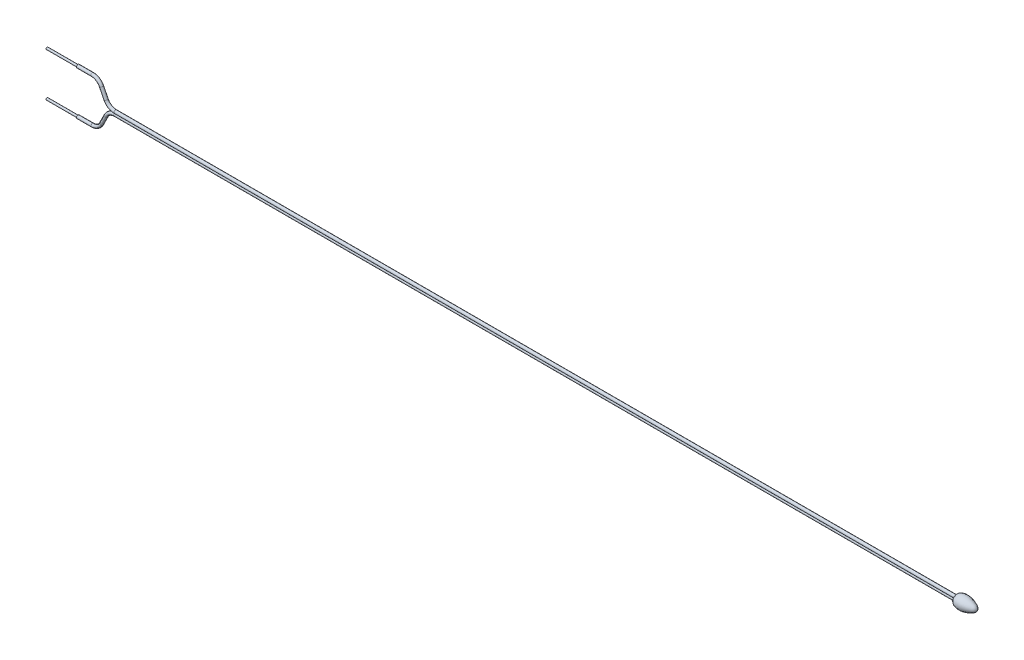
ISO-10303-21;
HEADER;
FILE_DESCRIPTION(('STEP AP214'),'2;1');
FILE_NAME('part.step','',(''),(''),'','','');
FILE_SCHEMA(('AUTOMOTIVE_DESIGN { 1 0 10303 214 1 1 1 1 }'));
ENDSEC;
DATA;
#1=APPLICATION_CONTEXT('core data for automotive mechanical design processes');
#2=APPLICATION_PROTOCOL_DEFINITION('international standard','automotive_design',2000,#1);
#3=PRODUCT_CONTEXT('',#1,'mechanical');
#4=PRODUCT('Part','Part','',(#3));
#5=PRODUCT_RELATED_PRODUCT_CATEGORY('part','',(#4));
#6=PRODUCT_DEFINITION_FORMATION('','',#4);
#7=PRODUCT_DEFINITION_CONTEXT('part definition',#1,'design');
#8=PRODUCT_DEFINITION('design','',#6,#7);
#9=PRODUCT_DEFINITION_SHAPE('','',#8);
#10=(LENGTH_UNIT() NAMED_UNIT(*) SI_UNIT(.MILLI.,.METRE.));
#11=(NAMED_UNIT(*) PLANE_ANGLE_UNIT() SI_UNIT($,.RADIAN.));
#12=(NAMED_UNIT(*) SI_UNIT($,.STERADIAN.) SOLID_ANGLE_UNIT());
#13=UNCERTAINTY_MEASURE_WITH_UNIT(LENGTH_MEASURE(1.E-05),#10,'distance_accuracy_value','');
#14=(GEOMETRIC_REPRESENTATION_CONTEXT(3) GLOBAL_UNCERTAINTY_ASSIGNED_CONTEXT((#13)) GLOBAL_UNIT_ASSIGNED_CONTEXT((#10,
#11,#12)) REPRESENTATION_CONTEXT('',''));
#15=CARTESIAN_POINT('',(0.,0.,0.));
#16=DIRECTION('',(0.,0.,1.));
#17=DIRECTION('',(1.,0.,0.));
#18=AXIS2_PLACEMENT_3D('',#15,#16,#17);
#19=CARTESIAN_POINT('',(-83.6180339887499,-2.11999999999998,0.));
#20=DIRECTION('',(-1.,0.,0.));
#21=DIRECTION('',(0.,-1.,0.));
#22=AXIS2_PLACEMENT_3D('',#19,#20,#21);
#23=CYLINDRICAL_SURFACE('',#22,0.15);
#24=CARTESIAN_POINT('',(-83.6180339887499,-2.11999999999998,0.));
#25=DIRECTION('',(1.,0.,0.));
#26=DIRECTION('',(0.,0.,1.));
#27=AXIS2_PLACEMENT_3D('',#24,#25,#26);
#28=CIRCLE('',#27,0.15);
#29=CARTESIAN_POINT('',(-83.6180339887499,-2.26999999999997,0.));
#30=VERTEX_POINT('',#29);
#31=EDGE_CURVE('E97',#30,#30,#28,.F.);
#32=ORIENTED_EDGE('',*,*,#31,.T.);
#33=EDGE_LOOP('',(#32));
#34=FACE_BOUND('',#33,.T.);
#35=CARTESIAN_POINT('',(-85.,-2.11999999999998,0.));
#36=DIRECTION('',(-1.,0.,0.));
#37=DIRECTION('',(0.,0.,1.));
#38=AXIS2_PLACEMENT_3D('',#35,#36,#37);
#39=CIRCLE('',#38,0.15);
#40=CARTESIAN_POINT('',(-85.,-2.11999999999998,0.15));
#41=VERTEX_POINT('',#40);
#42=EDGE_CURVE('E54',#41,#41,#39,.F.);
#43=ORIENTED_EDGE('',*,*,#42,.T.);
#44=EDGE_LOOP('',(#43));
#45=FACE_BOUND('',#44,.T.);
#46=ADVANCED_FACE('F49',(#34,#45),#23,.T.);
#47=CARTESIAN_POINT('',(-83.6180339887499,2.11999999999998,0.));
#48=DIRECTION('',(-1.,0.,0.));
#49=DIRECTION('',(0.,-1.,0.));
#50=AXIS2_PLACEMENT_3D('',#47,#48,#49);
#51=CYLINDRICAL_SURFACE('',#50,0.15);
#52=CARTESIAN_POINT('',(-83.6180339887499,2.11999999999998,0.));
#53=DIRECTION('',(-1.,0.,0.));
#54=DIRECTION('',(0.,0.,1.));
#55=AXIS2_PLACEMENT_3D('',#52,#53,#54);
#56=CIRCLE('',#55,0.15);
#57=CARTESIAN_POINT('',(-83.6180339887499,2.26999999999997,0.));
#58=VERTEX_POINT('',#57);
#59=EDGE_CURVE('E141',#58,#58,#56,.T.);
#60=ORIENTED_EDGE('',*,*,#59,.T.);
#61=EDGE_LOOP('',(#60));
#62=FACE_BOUND('',#61,.T.);
#63=CARTESIAN_POINT('',(-85.,2.11999999999998,0.));
#64=DIRECTION('',(-1.,0.,0.));
#65=DIRECTION('',(0.,0.,1.));
#66=AXIS2_PLACEMENT_3D('',#63,#64,#65);
#67=CIRCLE('',#66,0.15);
#68=CARTESIAN_POINT('',(-85.,2.11999999999998,0.15));
#69=VERTEX_POINT('',#68);
#70=EDGE_CURVE('E89',#69,#69,#67,.F.);
#71=ORIENTED_EDGE('',*,*,#70,.T.);
#72=EDGE_LOOP('',(#71));
#73=FACE_BOUND('',#72,.T.);
#74=ADVANCED_FACE('F183',(#62,#73),#51,.T.);
#75=CARTESIAN_POINT('',(2.,0.,0.));
#76=CARTESIAN_POINT('',(1.98555284849733,0.226242678434408,0.));
#77=CARTESIAN_POINT('',(1.44706791542776,0.470950786975522,0.));
#78=CARTESIAN_POINT('',(0.767947767259633,0.661200883018577,0.));
#79=CARTESIAN_POINT('',(0.11509678999317,0.55180024629002,0.));
#80=CARTESIAN_POINT('',(0.,0.3,0.));
#81=B_SPLINE_CURVE_WITH_KNOTS('',3,(#75,#76,#77,#78,#79,#80),.UNSPECIFIED.,.F.,.F.,(4,1,1,4),
(0.,0.27710911797728,0.65585589104176,1.),.UNSPECIFIED.);
#82=CARTESIAN_POINT('',(0.,0.,0.));
#83=DIRECTION('',(-1.,0.,0.));
#84=AXIS1_PLACEMENT('',#82,#83);
#85=SURFACE_OF_REVOLUTION('',#81,#84);
#86=CARTESIAN_POINT('',(0.,0.,0.));
#87=DIRECTION('',(-1.,0.,0.));
#88=DIRECTION('',(0.,0.,1.));
#89=AXIS2_PLACEMENT_3D('',#86,#87,#88);
#90=CIRCLE('',#89,0.3);
#91=CARTESIAN_POINT('',(0.,0.,0.3));
#92=VERTEX_POINT('',#91);
#93=EDGE_CURVE('E132',#92,#92,#90,.T.);
#94=ORIENTED_EDGE('',*,*,#93,.F.);
#95=EDGE_LOOP('',(#94));
#96=FACE_BOUND('',#95,.T.);
#97=CARTESIAN_POINT('',(2.,0.,0.));
#98=VERTEX_POINT('',#97);
#99=VERTEX_LOOP('',#98);
#100=FACE_BOUND('',#99,.T.);
#101=ADVANCED_FACE('F51',(#96,#100),#85,.T.);
#102=CARTESIAN_POINT('',(0.,0.,0.));
#103=DIRECTION('',(1.,0.,0.));
#104=DIRECTION('',(0.,0.,-1.));
#105=AXIS2_PLACEMENT_3D('',#102,#103,#104);
#106=PLANE('',#105);
#107=CARTESIAN_POINT('',(0.,0.11999999999999,0.));
#108=DIRECTION('',(-1.,0.,0.));
#109=DIRECTION('',(0.,0.,1.));
#110=AXIS2_PLACEMENT_3D('',#107,#108,#109);
#111=CIRCLE('',#110,0.15);
#112=CARTESIAN_POINT('',(0.,0.,0.0900000000000177));
#113=VERTEX_POINT('',#112);
#114=CARTESIAN_POINT('',(0.,0.,-0.0900000000000177));
#115=VERTEX_POINT('',#114);
#116=EDGE_CURVE('E60',#113,#115,#111,.T.);
#117=ORIENTED_EDGE('',*,*,#116,.F.);
#118=CARTESIAN_POINT('',(0.,-0.11999999999999,0.));
#119=DIRECTION('',(1.,0.,0.));
#120=DIRECTION('',(0.,0.,1.));
#121=AXIS2_PLACEMENT_3D('',#118,#119,#120);
#122=CIRCLE('',#121,0.15);
#123=EDGE_CURVE('E73',#115,#113,#122,.F.);
#124=ORIENTED_EDGE('',*,*,#123,.F.);
#125=EDGE_LOOP('',(#117,#124));
#126=FACE_BOUND('',#125,.T.);
#127=ORIENTED_EDGE('',*,*,#93,.T.);
#128=EDGE_LOOP('',(#127));
#129=FACE_BOUND('',#128,.T.);
#130=ADVANCED_FACE('F199',(#126,#129),#106,.F.);
#131=CARTESIAN_POINT('',(0.,0.11999999999999,0.));
#132=DIRECTION('',(-1.,0.,0.));
#133=DIRECTION('',(0.,-1.,0.));
#134=AXIS2_PLACEMENT_3D('',#131,#132,#133);
#135=CYLINDRICAL_SURFACE('',#134,0.15);
#136=DIRECTION('',(-1.,0.,0.));
#137=VECTOR('',#136,1.);
#138=CARTESIAN_POINT('',(-40.690983005625,0.,0.0900000000000201));
#139=LINE('',#138,#137);
#140=CARTESIAN_POINT('',(-81.3819660112501,0.,0.0900000000000256));
#141=VERTEX_POINT('',#140);
#142=EDGE_CURVE('E67',#113,#141,#139,.T.);
#143=ORIENTED_EDGE('',*,*,#142,.F.);
#144=ORIENTED_EDGE('',*,*,#116,.T.);
#145=DIRECTION('',(-1.,0.,0.));
#146=VECTOR('',#145,1.);
#147=CARTESIAN_POINT('',(-40.690983005625,0.,-0.0900000000000201));
#148=LINE('',#147,#146);
#149=CARTESIAN_POINT('',(-81.3819660112501,0.,-0.0900000000000258));
#150=VERTEX_POINT('',#149);
#151=EDGE_CURVE('E92',#150,#115,#148,.F.);
#152=ORIENTED_EDGE('',*,*,#151,.F.);
#153=CARTESIAN_POINT('',(-81.3819660112501,0.11999999999998,0.));
#154=DIRECTION('',(-1.,0.,0.));
#155=DIRECTION('',(0.,0.,1.));
#156=AXIS2_PLACEMENT_3D('',#153,#154,#155);
#157=CIRCLE('',#156,0.15);
#158=EDGE_CURVE('E83',#141,#150,#157,.T.);
#159=ORIENTED_EDGE('',*,*,#158,.F.);
#160=EDGE_LOOP('',(#143,#144,#152,#159));
#161=FACE_BOUND('',#160,.T.);
#162=ADVANCED_FACE('F93',(#161),#135,.T.);
#163=CARTESIAN_POINT('',(-81.3819660112501,1.11999999999999,0.));
#164=DIRECTION('',(0.,0.,-1.));
#165=DIRECTION('',(-1.,0.,0.));
#166=AXIS2_PLACEMENT_3D('',#163,#164,#165);
#167=TOROIDAL_SURFACE('',#166,1.00000000000001,0.15);
#168=CARTESIAN_POINT('',(-81.3817660112501,0.,0.0899999761904966));
#169=CARTESIAN_POINT('',(-81.3941999511317,0.,0.0899946856643932));
#170=CARTESIAN_POINT('',(-81.4066367126895,0.,0.0897292557588365));
#171=CARTESIAN_POINT('',(-81.4315179020639,0.,0.0886198504912969));
#172=CARTESIAN_POINT('',(-81.4439622584967,0.,0.0877743012960616));
#173=CARTESIAN_POINT('',(-81.4692420517624,0.,0.0854036456330393));
#174=CARTESIAN_POINT('',(-81.4820753363417,0.,0.0838550450728482));
#175=CARTESIAN_POINT('',(-81.507604881026,0.,0.0799277513643478));
#176=CARTESIAN_POINT('',(-81.5203012950561,0.,0.0775501197486745));
#177=CARTESIAN_POINT('',(-81.5452942327621,0.,0.0717308778791677));
#178=CARTESIAN_POINT('',(-81.5575936749774,0.,0.0683018064394664));
#179=CARTESIAN_POINT('',(-81.5816386670103,0.,0.0599109010634009));
#180=CARTESIAN_POINT('',(-81.5933874154472,0.,0.054959652055676));
#181=CARTESIAN_POINT('',(-81.6089976089805,0.,0.0460866496410345));
#182=CARTESIAN_POINT('',(-81.6134635900783,0.,0.0432479765029173));
#183=CARTESIAN_POINT('',(-81.6219376673659,0.,0.0369596194342492));
#184=CARTESIAN_POINT('',(-81.6259479391753,0.,0.033513058189557));
#185=CARTESIAN_POINT('',(-81.6312473522799,0.,0.0278418485689292));
#186=CARTESIAN_POINT('',(-81.6328613528702,0.,0.0259230812939052));
#187=CARTESIAN_POINT('',(-81.6358262335061,0.,0.0218860812592556));
#188=CARTESIAN_POINT('',(-81.6371769582982,0.,0.0197677318918337));
#189=CARTESIAN_POINT('',(-81.6395336118726,0.,0.0153035426964348));
#190=CARTESIAN_POINT('',(-81.6405343922266,0.,0.0129549084049622));
#191=CARTESIAN_POINT('',(-81.6420455870909,0.,0.00810601906349956));
#192=CARTESIAN_POINT('',(-81.6425573775655,0.,0.00560621063253131));
#193=CARTESIAN_POINT('',(-81.6429831732717,0.,0.000909082897122896));
#194=CARTESIAN_POINT('',(-81.6429708335507,0.,-0.00128159195684645));
#195=CARTESIAN_POINT('',(-81.6425305976109,0.,-0.00562124633058561));
#196=CARTESIAN_POINT('',(-81.6421023906153,0.,-0.00777019344224564));
#197=CARTESIAN_POINT('',(-81.6408142142647,0.,-0.0121834633316305));
#198=CARTESIAN_POINT('',(-81.6399128725151,0.,-0.0144354505340947));
#199=CARTESIAN_POINT('',(-81.6377580667204,0.,-0.0187629504687158));
#200=CARTESIAN_POINT('',(-81.6365040254415,0.,-0.0208381665790506));
#201=CARTESIAN_POINT('',(-81.6329547766263,0.,-0.0259226292014645));
#202=CARTESIAN_POINT('',(-81.6304711628279,0.,-0.0287989052738595));
#203=CARTESIAN_POINT('',(-81.6251105865066,0.,-0.0341535811056035));
#204=CARTESIAN_POINT('',(-81.6222326102461,0.,-0.036630918454396));
#205=CARTESIAN_POINT('',(-81.6132343439585,0.,-0.0435719653554632));
#206=CARTESIAN_POINT('',(-81.6067447415627,0.,-0.0475505880966286));
#207=CARTESIAN_POINT('',(-81.5933112417463,0.,-0.0546324836015175));
#208=CARTESIAN_POINT('',(-81.5863658828305,0.,-0.0577327519696139));
#209=CARTESIAN_POINT('',(-81.5682845816545,0.,-0.0648522648280483));
#210=CARTESIAN_POINT('',(-81.5569721990893,0.,-0.0684194353613946));
#211=CARTESIAN_POINT('',(-81.5340664005827,0.,-0.0745207557875529));
#212=CARTESIAN_POINT('',(-81.5224724096546,0.,-0.077052563642075));
#213=CARTESIAN_POINT('',(-81.4874155503165,0.,-0.0835074716218438));
#214=CARTESIAN_POINT('',(-81.4637371749713,0.,-0.0862708247678917));
#215=CARTESIAN_POINT('',(-81.4302792157585,0.,-0.0886531171180191));
#216=CARTESIAN_POINT('',(-81.4205405983142,0.,-0.0891653471513131));
#217=CARTESIAN_POINT('',(-81.4011245484738,0.,-0.0898385229848501));
#218=CARTESIAN_POINT('',(-81.3914472074271,0.,-0.0900020844472987));
#219=CARTESIAN_POINT('',(-81.3817660112501,0.,-0.0899999761904965));
#220=B_SPLINE_CURVE_WITH_KNOTS('',3,(#168,#169,#170,#171,#172,#173,#174,#175,#176,#177,#178,
#179,#180,#181,#182,#183,#184,#185,#186,#187,#188,#189,#190,#191,#192,#193,#194,#195,#196,#197,
#198,#199,#200,#201,#202,#203,#204,#205,#206,#207,#208,#209,#210,#211,#212,#213,#214,#215,#216,
#217,#218,#219),.UNSPECIFIED.,.F.,.F.,(4,2,2,2,2,2,2,2,2,2,2,2,2,2,2,2,2,2,2,2,2,2,2,2,2,4),(0.,
0.0373034933423883,0.0747085913792754,0.113467884668019,0.15217772978408,0.190442805547962,
0.228447591979803,0.244292374471615,0.260058015695166,0.26756364544745,0.275073687957925,
0.282689980298665,0.290284777547229,0.296816366568286,0.303352840391313,0.310590184876106,
0.317839443741918,0.329175457937243,0.340541178822971,0.363250074947801,0.386035733668575,
0.421531759758929,0.457107641183707,0.528445041645294,0.557699417610195,0.586733547646857),.UNSPECIFIED.);
#221=EDGE_CURVE('E11',#141,#150,#220,.T.);
#222=ORIENTED_EDGE('',*,*,#221,.F.);
#223=ORIENTED_EDGE('',*,*,#158,.T.);
#224=EDGE_LOOP('',(#222,#223));
#225=FACE_BOUND('',#224,.T.);
#226=CARTESIAN_POINT('',(-82.27639320225,0.672786404500026,0.));
#227=DIRECTION('',(-0.44721359549996,0.894427190999915,0.));
#228=DIRECTION('',(0.,0.,1.));
#229=AXIS2_PLACEMENT_3D('',#226,#227,#228);
#230=CIRCLE('',#229,0.15);
#231=CARTESIAN_POINT('',(-82.27639320225,0.672786404500026,0.15));
#232=VERTEX_POINT('',#231);
#233=EDGE_CURVE('E88',#232,#232,#230,.T.);
#234=ORIENTED_EDGE('',*,*,#233,.F.);
#235=EDGE_LOOP('',(#234));
#236=FACE_BOUND('',#235,.T.);
#237=ADVANCED_FACE('F85',(#225,#236),#167,.T.);
#238=CARTESIAN_POINT('',(-82.27639320225,0.672786404500027,0.));
#239=DIRECTION('',(-0.447213595499958,0.894427190999916,0.));
#240=DIRECTION('',(-0.894427190999916,-0.447213595499958,0.));
#241=AXIS2_PLACEMENT_3D('',#238,#239,#240);
#242=CYLINDRICAL_SURFACE('',#241,0.15);
#243=CARTESIAN_POINT('',(-82.72360679775,1.56721359549994,0.));
#244=DIRECTION('',(-0.447213595499958,0.894427190999916,0.));
#245=DIRECTION('',(0.,0.,1.));
#246=AXIS2_PLACEMENT_3D('',#243,#244,#245);
#247=CIRCLE('',#246,0.15);
#248=CARTESIAN_POINT('',(-82.5894427191,1.63429563482494,0.));
#249=VERTEX_POINT('',#248);
#250=EDGE_CURVE('E137',#249,#249,#247,.T.);
#251=ORIENTED_EDGE('',*,*,#250,.F.);
#252=EDGE_LOOP('',(#251));
#253=FACE_BOUND('',#252,.T.);
#254=ORIENTED_EDGE('',*,*,#233,.T.);
#255=EDGE_LOOP('',(#254));
#256=FACE_BOUND('',#255,.T.);
#257=ADVANCED_FACE('F204',(#253,#256),#242,.T.);
#258=CARTESIAN_POINT('',(-83.6180339887499,1.11999999999999,0.));
#259=DIRECTION('',(0.,0.,1.));
#260=DIRECTION('',(1.,0.,0.));
#261=AXIS2_PLACEMENT_3D('',#258,#259,#260);
#262=TOROIDAL_SURFACE('',#261,0.999999999999983,0.15);
#263=CARTESIAN_POINT('',(-83.6180339887499,1.11999999999999,0.));
#264=DIRECTION('',(0.,0.,1.));
#265=DIRECTION('',(1.,0.,0.));
#266=AXIS2_PLACEMENT_3D('',#263,#264,#265);
#267=CIRCLE('',#266,1.14999999999998);
#268=EDGE_CURVE('',#249,#58,#267,.T.);
#269=ORIENTED_EDGE('',*,*,#250,.T.);
#270=ORIENTED_EDGE('',*,*,#59,.F.);
#271=ORIENTED_EDGE('',*,*,#268,.T.);
#272=ORIENTED_EDGE('',*,*,#268,.F.);
#273=EDGE_LOOP('',(#269,#271,#270,#272));
#274=FACE_BOUND('',#273,.T.);
#275=ADVANCED_FACE('F196',(#274),#262,.T.);
#276=CARTESIAN_POINT('',(-85.,2.11999999999999,0.));
#277=DIRECTION('',(-1.,0.,0.));
#278=DIRECTION('',(0.,0.,1.));
#279=AXIS2_PLACEMENT_3D('',#276,#277,#278);
#280=PLANE('',#279);
#281=ORIENTED_EDGE('',*,*,#70,.F.);
#282=EDGE_LOOP('',(#281));
#283=FACE_BOUND('',#282,.T.);
#284=CARTESIAN_POINT('',(-85.,2.11999999999999,0.));
#285=DIRECTION('',(-1.,0.,0.));
#286=DIRECTION('',(0.,0.,1.));
#287=AXIS2_PLACEMENT_3D('',#284,#285,#286);
#288=CIRCLE('',#287,0.0999999999999999);
#289=CARTESIAN_POINT('',(-85.,2.11999999999999,0.0999999999999999));
#290=VERTEX_POINT('',#289);
#291=EDGE_CURVE('E124',#290,#290,#288,.T.);
#292=ORIENTED_EDGE('',*,*,#291,.F.);
#293=EDGE_LOOP('',(#292));
#294=FACE_BOUND('',#293,.T.);
#295=ADVANCED_FACE('F193',(#283,#294),#280,.T.);
#296=CARTESIAN_POINT('',(-85.,2.11999999999999,0.));
#297=DIRECTION('',(-1.,0.,0.));
#298=DIRECTION('',(0.,0.,1.));
#299=AXIS2_PLACEMENT_3D('',#296,#297,#298);
#300=CYLINDRICAL_SURFACE('',#299,0.0999999999999999);
#301=ORIENTED_EDGE('',*,*,#291,.T.);
#302=EDGE_LOOP('',(#301));
#303=FACE_BOUND('',#302,.T.);
#304=CARTESIAN_POINT('',(-88.,2.11999999999999,0.));
#305=DIRECTION('',(-1.,0.,0.));
#306=DIRECTION('',(0.,0.,1.));
#307=AXIS2_PLACEMENT_3D('',#304,#305,#306);
#308=CIRCLE('',#307,0.0999999999999999);
#309=CARTESIAN_POINT('',(-88.,2.11999999999999,0.0999999999999999));
#310=VERTEX_POINT('',#309);
#311=EDGE_CURVE('E123',#310,#310,#308,.T.);
#312=ORIENTED_EDGE('',*,*,#311,.F.);
#313=EDGE_LOOP('',(#312));
#314=FACE_BOUND('',#313,.T.);
#315=ADVANCED_FACE('F190',(#303,#314),#300,.T.);
#316=CARTESIAN_POINT('',(-88.,2.11999999999998,0.));
#317=DIRECTION('',(-1.,0.,0.));
#318=DIRECTION('',(0.,0.,1.));
#319=AXIS2_PLACEMENT_3D('',#316,#317,#318);
#320=PLANE('',#319);
#321=ORIENTED_EDGE('',*,*,#311,.T.);
#322=EDGE_LOOP('',(#321));
#323=FACE_BOUND('',#322,.T.);
#324=ADVANCED_FACE('F180',(#323),#320,.T.);
#325=CARTESIAN_POINT('',(0.,-0.11999999999999,0.));
#326=DIRECTION('',(-1.,0.,0.));
#327=DIRECTION('',(0.,-1.,0.));
#328=AXIS2_PLACEMENT_3D('',#325,#326,#327);
#329=CYLINDRICAL_SURFACE('',#328,0.15);
#330=ORIENTED_EDGE('',*,*,#123,.T.);
#331=ORIENTED_EDGE('',*,*,#142,.T.);
#332=CARTESIAN_POINT('',(-81.3819660112501,-0.11999999999998,0.));
#333=DIRECTION('',(1.,0.,0.));
#334=DIRECTION('',(0.,0.,1.));
#335=AXIS2_PLACEMENT_3D('',#332,#333,#334);
#336=CIRCLE('',#335,0.15);
#337=EDGE_CURVE('E102',#150,#141,#336,.F.);
#338=ORIENTED_EDGE('',*,*,#337,.F.);
#339=ORIENTED_EDGE('',*,*,#151,.T.);
#340=EDGE_LOOP('',(#330,#331,#338,#339));
#341=FACE_BOUND('',#340,.T.);
#342=ADVANCED_FACE('F103',(#341),#329,.T.);
#343=CARTESIAN_POINT('',(-81.3819660112501,-1.11999999999999,0.));
#344=DIRECTION('',(0.,0.,1.));
#345=DIRECTION('',(1.,0.,0.));
#346=AXIS2_PLACEMENT_3D('',#343,#344,#345);
#347=TOROIDAL_SURFACE('',#346,1.00000000000001,0.15);
#348=CARTESIAN_POINT('',(-82.27639320225,-0.672786404500026,0.));
#349=DIRECTION('',(0.44721359549996,0.894427190999915,0.));
#350=DIRECTION('',(0.,0.,1.));
#351=AXIS2_PLACEMENT_3D('',#348,#349,#350);
#352=CIRCLE('',#351,0.15);
#353=CARTESIAN_POINT('',(-82.27639320225,-0.672786404500026,0.15));
#354=VERTEX_POINT('',#353);
#355=EDGE_CURVE('E105',#354,#354,#352,.F.);
#356=ORIENTED_EDGE('',*,*,#355,.F.);
#357=EDGE_LOOP('',(#356));
#358=FACE_BOUND('',#357,.T.);
#359=ORIENTED_EDGE('',*,*,#337,.T.);
#360=ORIENTED_EDGE('',*,*,#221,.T.);
#361=EDGE_LOOP('',(#359,#360));
#362=FACE_BOUND('',#361,.T.);
#363=ADVANCED_FACE('F101',(#358,#362),#347,.T.);
#364=CARTESIAN_POINT('',(-82.27639320225,-0.672786404500027,0.));
#365=DIRECTION('',(-0.447213595499958,-0.894427190999916,0.));
#366=DIRECTION('',(0.894427190999916,-0.447213595499958,0.));
#367=AXIS2_PLACEMENT_3D('',#364,#365,#366);
#368=CYLINDRICAL_SURFACE('',#367,0.15);
#369=CARTESIAN_POINT('',(-82.72360679775,-1.56721359549994,0.));
#370=DIRECTION('',(0.447213595499958,0.894427190999916,0.));
#371=DIRECTION('',(0.,0.,1.));
#372=AXIS2_PLACEMENT_3D('',#369,#370,#371);
#373=CIRCLE('',#372,0.15);
#374=CARTESIAN_POINT('',(-82.5894427191,-1.63429563482494,0.));
#375=VERTEX_POINT('',#374);
#376=EDGE_CURVE('E110',#375,#375,#373,.F.);
#377=ORIENTED_EDGE('',*,*,#376,.F.);
#378=EDGE_LOOP('',(#377));
#379=FACE_BOUND('',#378,.T.);
#380=ORIENTED_EDGE('',*,*,#355,.T.);
#381=EDGE_LOOP('',(#380));
#382=FACE_BOUND('',#381,.T.);
#383=ADVANCED_FACE('F169',(#379,#382),#368,.T.);
#384=CARTESIAN_POINT('',(-83.6180339887499,-1.11999999999999,0.));
#385=DIRECTION('',(0.,0.,-1.));
#386=DIRECTION('',(-1.,0.,0.));
#387=AXIS2_PLACEMENT_3D('',#384,#385,#386);
#388=TOROIDAL_SURFACE('',#387,0.999999999999983,0.15);
#389=CARTESIAN_POINT('',(-83.6180339887499,-1.11999999999999,0.));
#390=DIRECTION('',(0.,0.,-1.));
#391=DIRECTION('',(-1.,0.,0.));
#392=AXIS2_PLACEMENT_3D('',#389,#390,#391);
#393=CIRCLE('',#392,1.14999999999998);
#394=EDGE_CURVE('',#375,#30,#393,.T.);
#395=ORIENTED_EDGE('',*,*,#376,.T.);
#396=ORIENTED_EDGE('',*,*,#31,.F.);
#397=ORIENTED_EDGE('',*,*,#394,.T.);
#398=ORIENTED_EDGE('',*,*,#394,.F.);
#399=EDGE_LOOP('',(#395,#397,#396,#398));
#400=FACE_BOUND('',#399,.T.);
#401=ADVANCED_FACE('F174',(#400),#388,.T.);
#402=CARTESIAN_POINT('',(-85.,-2.11999999999999,0.));
#403=DIRECTION('',(-1.,0.,0.));
#404=DIRECTION('',(0.,0.,1.));
#405=AXIS2_PLACEMENT_3D('',#402,#403,#404);
#406=PLANE('',#405);
#407=ORIENTED_EDGE('',*,*,#42,.F.);
#408=EDGE_LOOP('',(#407));
#409=FACE_BOUND('',#408,.T.);
#410=CARTESIAN_POINT('',(-85.,-2.11999999999999,0.));
#411=DIRECTION('',(1.,0.,0.));
#412=DIRECTION('',(0.,0.,1.));
#413=AXIS2_PLACEMENT_3D('',#410,#411,#412);
#414=CIRCLE('',#413,0.0999999999999999);
#415=CARTESIAN_POINT('',(-85.,-2.11999999999999,0.0999999999999999));
#416=VERTEX_POINT('',#415);
#417=EDGE_CURVE('E244',#416,#416,#414,.T.);
#418=ORIENTED_EDGE('',*,*,#417,.T.);
#419=EDGE_LOOP('',(#418));
#420=FACE_BOUND('',#419,.T.);
#421=ADVANCED_FACE('F178',(#409,#420),#406,.T.);
#422=CARTESIAN_POINT('',(-85.,-2.11999999999999,0.));
#423=DIRECTION('',(-1.,0.,0.));
#424=DIRECTION('',(0.,0.,1.));
#425=AXIS2_PLACEMENT_3D('',#422,#423,#424);
#426=CYLINDRICAL_SURFACE('',#425,0.0999999999999999);
#427=ORIENTED_EDGE('',*,*,#417,.F.);
#428=EDGE_LOOP('',(#427));
#429=FACE_BOUND('',#428,.T.);
#430=CARTESIAN_POINT('',(-88.,-2.11999999999999,0.));
#431=DIRECTION('',(1.,0.,0.));
#432=DIRECTION('',(0.,0.,1.));
#433=AXIS2_PLACEMENT_3D('',#430,#431,#432);
#434=CIRCLE('',#433,0.0999999999999999);
#435=CARTESIAN_POINT('',(-88.,-2.11999999999999,0.0999999999999999));
#436=VERTEX_POINT('',#435);
#437=EDGE_CURVE('E246',#436,#436,#434,.T.);
#438=ORIENTED_EDGE('',*,*,#437,.T.);
#439=EDGE_LOOP('',(#438));
#440=FACE_BOUND('',#439,.T.);
#441=ADVANCED_FACE('F188',(#429,#440),#426,.T.);
#442=CARTESIAN_POINT('',(-88.,-2.11999999999998,0.));
#443=DIRECTION('',(-1.,0.,0.));
#444=DIRECTION('',(0.,0.,1.));
#445=AXIS2_PLACEMENT_3D('',#442,#443,#444);
#446=PLANE('',#445);
#447=ORIENTED_EDGE('',*,*,#437,.F.);
#448=EDGE_LOOP('',(#447));
#449=FACE_BOUND('',#448,.T.);
#450=ADVANCED_FACE('F185',(#449),#446,.T.);
#451=CLOSED_SHELL('',(#46,#74,#101,#130,#162,#237,#257,#275,#295,#315,#324,#342,#363,#383,#401,
#421,#441,#450));
#452=MANIFOLD_SOLID_BREP('B2',#451);
#453=ADVANCED_BREP_SHAPE_REPRESENTATION('',(#18,#452),#14);
#454=SHAPE_DEFINITION_REPRESENTATION(#9,#453);
ENDSEC;
END-ISO-10303-21;
